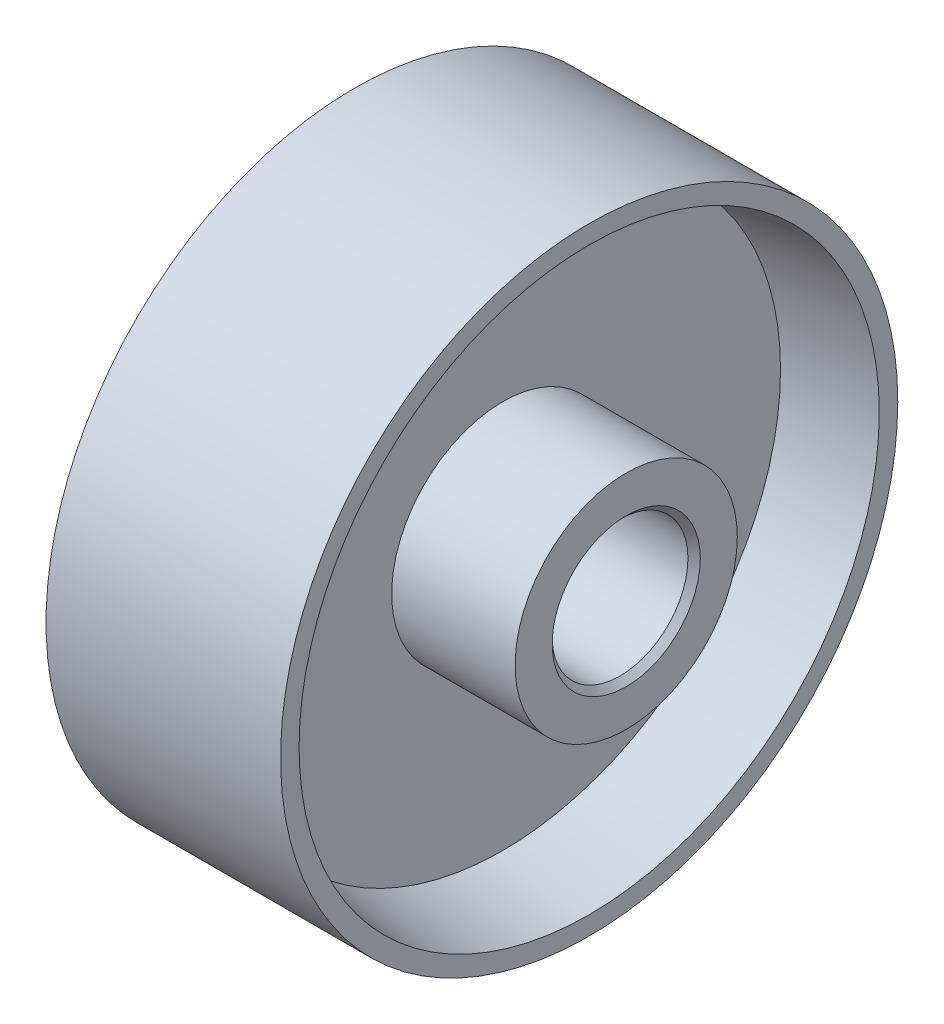
ISO-10303-21;
HEADER;
FILE_DESCRIPTION(('STEP AP214'),'2;1');
FILE_NAME('part.step','',(''),(''),'','','');
FILE_SCHEMA(('AUTOMOTIVE_DESIGN { 1 0 10303 214 1 1 1 1 }'));
ENDSEC;
DATA;
#1=APPLICATION_CONTEXT('core data for automotive mechanical design processes');
#2=APPLICATION_PROTOCOL_DEFINITION('international standard','automotive_design',2000,#1);
#3=PRODUCT_CONTEXT('',#1,'mechanical');
#4=PRODUCT('Part','Part','',(#3));
#5=PRODUCT_RELATED_PRODUCT_CATEGORY('part','',(#4));
#6=PRODUCT_DEFINITION_FORMATION('','',#4);
#7=PRODUCT_DEFINITION_CONTEXT('part definition',#1,'design');
#8=PRODUCT_DEFINITION('design','',#6,#7);
#9=PRODUCT_DEFINITION_SHAPE('','',#8);
#10=(LENGTH_UNIT() NAMED_UNIT(*) SI_UNIT(.MILLI.,.METRE.));
#11=(NAMED_UNIT(*) PLANE_ANGLE_UNIT() SI_UNIT($,.RADIAN.));
#12=(NAMED_UNIT(*) SI_UNIT($,.STERADIAN.) SOLID_ANGLE_UNIT());
#13=UNCERTAINTY_MEASURE_WITH_UNIT(LENGTH_MEASURE(1.E-05),#10,'distance_accuracy_value','');
#14=(GEOMETRIC_REPRESENTATION_CONTEXT(3) GLOBAL_UNCERTAINTY_ASSIGNED_CONTEXT((#13)) GLOBAL_UNIT_ASSIGNED_CONTEXT((#10,
#11,#12)) REPRESENTATION_CONTEXT('',''));
#15=CARTESIAN_POINT('',(0.,0.,0.));
#16=DIRECTION('',(0.,0.,1.));
#17=DIRECTION('',(1.,0.,0.));
#18=AXIS2_PLACEMENT_3D('',#15,#16,#17);
#19=CARTESIAN_POINT('',(-25.,18.,0.));
#20=DIRECTION('',(-1.,0.,0.));
#21=DIRECTION('',(0.,0.,1.));
#22=AXIS2_PLACEMENT_3D('',#19,#20,#21);
#23=PLANE('',#22);
#24=CARTESIAN_POINT('',(-25.,0.,0.));
#25=DIRECTION('',(-1.,0.,0.));
#26=DIRECTION('',(0.,0.,1.));
#27=AXIS2_PLACEMENT_3D('',#24,#25,#26);
#28=CIRCLE('',#27,12.);
#29=CARTESIAN_POINT('',(-25.,0.,12.));
#30=VERTEX_POINT('',#29);
#31=EDGE_CURVE('E45',#30,#30,#28,.F.);
#32=ORIENTED_EDGE('',*,*,#31,.T.);
#33=EDGE_LOOP('',(#32));
#34=FACE_BOUND('',#33,.T.);
#35=CARTESIAN_POINT('',(-25.,0.,0.));
#36=DIRECTION('',(1.,0.,0.));
#37=DIRECTION('',(0.,0.,-1.));
#38=AXIS2_PLACEMENT_3D('',#35,#36,#37);
#39=CIRCLE('',#38,18.);
#40=CARTESIAN_POINT('',(-25.,0.,-18.));
#41=VERTEX_POINT('',#40);
#42=EDGE_CURVE('E50',#41,#41,#39,.T.);
#43=ORIENTED_EDGE('',*,*,#42,.F.);
#44=EDGE_LOOP('',(#43));
#45=FACE_BOUND('',#44,.T.);
#46=ADVANCED_FACE('F30',(#34,#45),#23,.T.);
#47=CARTESIAN_POINT('',(-40.6358428805237,0.,0.));
#48=DIRECTION('',(1.,0.,0.));
#49=DIRECTION('',(0.,0.,-1.));
#50=AXIS2_PLACEMENT_3D('',#47,#48,#49);
#51=CYLINDRICAL_SURFACE('',#50,18.);
#52=ORIENTED_EDGE('',*,*,#42,.T.);
#53=EDGE_LOOP('',(#52));
#54=FACE_BOUND('',#53,.T.);
#55=CARTESIAN_POINT('',(-5.,0.,0.));
#56=DIRECTION('',(1.,0.,0.));
#57=DIRECTION('',(0.,0.,-1.));
#58=AXIS2_PLACEMENT_3D('',#55,#56,#57);
#59=CIRCLE('',#58,18.);
#60=CARTESIAN_POINT('',(-5.,0.,-18.));
#61=VERTEX_POINT('',#60);
#62=EDGE_CURVE('E53',#61,#61,#59,.T.);
#63=ORIENTED_EDGE('',*,*,#62,.F.);
#64=EDGE_LOOP('',(#63));
#65=FACE_BOUND('',#64,.T.);
#66=ADVANCED_FACE('F98',(#54,#65),#51,.T.);
#67=CARTESIAN_POINT('',(-5.,45.,0.));
#68=DIRECTION('',(-1.,0.,0.));
#69=DIRECTION('',(0.,0.,1.));
#70=AXIS2_PLACEMENT_3D('',#67,#68,#69);
#71=PLANE('',#70);
#72=ORIENTED_EDGE('',*,*,#62,.T.);
#73=EDGE_LOOP('',(#72));
#74=FACE_BOUND('',#73,.T.);
#75=CARTESIAN_POINT('',(-5.,0.,0.));
#76=DIRECTION('',(1.,0.,0.));
#77=DIRECTION('',(0.,0.,-1.));
#78=AXIS2_PLACEMENT_3D('',#75,#76,#77);
#79=CIRCLE('',#78,45.);
#80=CARTESIAN_POINT('',(-5.,0.,-45.));
#81=VERTEX_POINT('',#80);
#82=EDGE_CURVE('E56',#81,#81,#79,.T.);
#83=ORIENTED_EDGE('',*,*,#82,.F.);
#84=EDGE_LOOP('',(#83));
#85=FACE_BOUND('',#84,.T.);
#86=ADVANCED_FACE('F104',(#74,#85),#71,.T.);
#87=CARTESIAN_POINT('',(-19.,0.,0.));
#88=DIRECTION('',(-1.,0.,0.));
#89=DIRECTION('',(0.,0.,1.));
#90=AXIS2_PLACEMENT_3D('',#87,#88,#89);
#91=CONICAL_SURFACE('',#90,47.,0.141897054604164);
#92=ORIENTED_EDGE('',*,*,#82,.T.);
#93=EDGE_LOOP('',(#92));
#94=FACE_BOUND('',#93,.T.);
#95=CARTESIAN_POINT('',(-19.,0.,0.));
#96=DIRECTION('',(1.,0.,0.));
#97=DIRECTION('',(0.,0.,-1.));
#98=AXIS2_PLACEMENT_3D('',#95,#96,#97);
#99=CIRCLE('',#98,47.);
#100=CARTESIAN_POINT('',(-19.,0.,-47.));
#101=VERTEX_POINT('',#100);
#102=EDGE_CURVE('E59',#101,#101,#99,.T.);
#103=ORIENTED_EDGE('',*,*,#102,.F.);
#104=EDGE_LOOP('',(#103));
#105=FACE_BOUND('',#104,.T.);
#106=ADVANCED_FACE('F183',(#94,#105),#91,.F.);
#107=CARTESIAN_POINT('',(-19.,50.,0.));
#108=DIRECTION('',(-1.,0.,0.));
#109=DIRECTION('',(0.,0.,1.));
#110=AXIS2_PLACEMENT_3D('',#107,#108,#109);
#111=PLANE('',#110);
#112=ORIENTED_EDGE('',*,*,#102,.T.);
#113=EDGE_LOOP('',(#112));
#114=FACE_BOUND('',#113,.T.);
#115=CARTESIAN_POINT('',(-19.,0.,0.));
#116=DIRECTION('',(1.,0.,0.));
#117=DIRECTION('',(0.,0.,-1.));
#118=AXIS2_PLACEMENT_3D('',#115,#116,#117);
#119=CIRCLE('',#118,50.);
#120=CARTESIAN_POINT('',(-19.,0.,-50.));
#121=VERTEX_POINT('',#120);
#122=EDGE_CURVE('E62',#121,#121,#119,.T.);
#123=ORIENTED_EDGE('',*,*,#122,.F.);
#124=EDGE_LOOP('',(#123));
#125=FACE_BOUND('',#124,.T.);
#126=ADVANCED_FACE('F173',(#114,#125),#111,.T.);
#127=CARTESIAN_POINT('',(-40.6358428805237,0.,0.));
#128=DIRECTION('',(1.,0.,0.));
#129=DIRECTION('',(0.,0.,-1.));
#130=AXIS2_PLACEMENT_3D('',#127,#128,#129);
#131=CYLINDRICAL_SURFACE('',#130,50.);
#132=ORIENTED_EDGE('',*,*,#122,.T.);
#133=EDGE_LOOP('',(#132));
#134=FACE_BOUND('',#133,.T.);
#135=CARTESIAN_POINT('',(19.,0.,0.));
#136=DIRECTION('',(1.,0.,0.));
#137=DIRECTION('',(0.,0.,-1.));
#138=AXIS2_PLACEMENT_3D('',#135,#136,#137);
#139=CIRCLE('',#138,50.);
#140=CARTESIAN_POINT('',(19.,0.,-50.));
#141=VERTEX_POINT('',#140);
#142=EDGE_CURVE('E65',#141,#141,#139,.T.);
#143=ORIENTED_EDGE('',*,*,#142,.F.);
#144=EDGE_LOOP('',(#143));
#145=FACE_BOUND('',#144,.T.);
#146=ADVANCED_FACE('F163',(#134,#145),#131,.T.);
#147=CARTESIAN_POINT('',(19.,47.,0.));
#148=DIRECTION('',(1.,0.,0.));
#149=DIRECTION('',(0.,0.,-1.));
#150=AXIS2_PLACEMENT_3D('',#147,#148,#149);
#151=PLANE('',#150);
#152=ORIENTED_EDGE('',*,*,#142,.T.);
#153=EDGE_LOOP('',(#152));
#154=FACE_BOUND('',#153,.T.);
#155=CARTESIAN_POINT('',(19.,0.,0.));
#156=DIRECTION('',(1.,0.,0.));
#157=DIRECTION('',(0.,0.,-1.));
#158=AXIS2_PLACEMENT_3D('',#155,#156,#157);
#159=CIRCLE('',#158,47.);
#160=CARTESIAN_POINT('',(19.,0.,-47.));
#161=VERTEX_POINT('',#160);
#162=EDGE_CURVE('E68',#161,#161,#159,.T.);
#163=ORIENTED_EDGE('',*,*,#162,.F.);
#164=EDGE_LOOP('',(#163));
#165=FACE_BOUND('',#164,.T.);
#166=ADVANCED_FACE('F153',(#154,#165),#151,.T.);
#167=CARTESIAN_POINT('',(5.,0.,0.));
#168=DIRECTION('',(1.,0.,0.));
#169=DIRECTION('',(0.,0.,-1.));
#170=AXIS2_PLACEMENT_3D('',#167,#168,#169);
#171=CONICAL_SURFACE('',#170,45.,0.141897054604164);
#172=ORIENTED_EDGE('',*,*,#162,.T.);
#173=EDGE_LOOP('',(#172));
#174=FACE_BOUND('',#173,.T.);
#175=CARTESIAN_POINT('',(5.,0.,0.));
#176=DIRECTION('',(1.,0.,0.));
#177=DIRECTION('',(0.,0.,-1.));
#178=AXIS2_PLACEMENT_3D('',#175,#176,#177);
#179=CIRCLE('',#178,45.);
#180=CARTESIAN_POINT('',(5.,0.,-45.));
#181=VERTEX_POINT('',#180);
#182=EDGE_CURVE('E71',#181,#181,#179,.T.);
#183=ORIENTED_EDGE('',*,*,#182,.F.);
#184=EDGE_LOOP('',(#183));
#185=FACE_BOUND('',#184,.T.);
#186=ADVANCED_FACE('F94',(#174,#185),#171,.F.);
#187=CARTESIAN_POINT('',(5.,18.,0.));
#188=DIRECTION('',(1.,0.,0.));
#189=DIRECTION('',(0.,0.,-1.));
#190=AXIS2_PLACEMENT_3D('',#187,#188,#189);
#191=PLANE('',#190);
#192=ORIENTED_EDGE('',*,*,#182,.T.);
#193=EDGE_LOOP('',(#192));
#194=FACE_BOUND('',#193,.T.);
#195=CARTESIAN_POINT('',(5.,0.,0.));
#196=DIRECTION('',(1.,0.,0.));
#197=DIRECTION('',(0.,0.,-1.));
#198=AXIS2_PLACEMENT_3D('',#195,#196,#197);
#199=CIRCLE('',#198,18.);
#200=CARTESIAN_POINT('',(5.,0.,-18.));
#201=VERTEX_POINT('',#200);
#202=EDGE_CURVE('E74',#201,#201,#199,.T.);
#203=ORIENTED_EDGE('',*,*,#202,.F.);
#204=EDGE_LOOP('',(#203));
#205=FACE_BOUND('',#204,.T.);
#206=ADVANCED_FACE('F85',(#194,#205),#191,.T.);
#207=CARTESIAN_POINT('',(-40.6358428805237,0.,0.));
#208=DIRECTION('',(1.,0.,0.));
#209=DIRECTION('',(0.,0.,-1.));
#210=AXIS2_PLACEMENT_3D('',#207,#208,#209);
#211=CYLINDRICAL_SURFACE('',#210,18.);
#212=ORIENTED_EDGE('',*,*,#202,.T.);
#213=EDGE_LOOP('',(#212));
#214=FACE_BOUND('',#213,.T.);
#215=CARTESIAN_POINT('',(25.,0.,0.));
#216=DIRECTION('',(1.,0.,0.));
#217=DIRECTION('',(0.,0.,-1.));
#218=AXIS2_PLACEMENT_3D('',#215,#216,#217);
#219=CIRCLE('',#218,18.);
#220=CARTESIAN_POINT('',(25.,0.,-18.));
#221=VERTEX_POINT('',#220);
#222=EDGE_CURVE('E77',#221,#221,#219,.T.);
#223=ORIENTED_EDGE('',*,*,#222,.F.);
#224=EDGE_LOOP('',(#223));
#225=FACE_BOUND('',#224,.T.);
#226=ADVANCED_FACE('F83',(#214,#225),#211,.T.);
#227=CARTESIAN_POINT('',(25.,11.,0.));
#228=DIRECTION('',(1.,0.,0.));
#229=DIRECTION('',(0.,0.,-1.));
#230=AXIS2_PLACEMENT_3D('',#227,#228,#229);
#231=PLANE('',#230);
#232=CARTESIAN_POINT('',(25.,0.,0.));
#233=DIRECTION('',(1.,0.,0.));
#234=DIRECTION('',(0.,0.,-1.));
#235=AXIS2_PLACEMENT_3D('',#232,#233,#234);
#236=CIRCLE('',#235,12.);
#237=CARTESIAN_POINT('',(25.,0.,-12.));
#238=VERTEX_POINT('',#237);
#239=EDGE_CURVE('E10',#238,#238,#236,.F.);
#240=ORIENTED_EDGE('',*,*,#239,.T.);
#241=EDGE_LOOP('',(#240));
#242=FACE_BOUND('',#241,.T.);
#243=ORIENTED_EDGE('',*,*,#222,.T.);
#244=EDGE_LOOP('',(#243));
#245=FACE_BOUND('',#244,.T.);
#246=ADVANCED_FACE('F81',(#242,#245),#231,.T.);
#247=CARTESIAN_POINT('',(-40.6358428805237,0.,0.));
#248=DIRECTION('',(1.,0.,0.));
#249=DIRECTION('',(0.,0.,-1.));
#250=AXIS2_PLACEMENT_3D('',#247,#248,#249);
#251=CYLINDRICAL_SURFACE('',#250,11.);
#252=CARTESIAN_POINT('',(-24.,0.,0.));
#253=DIRECTION('',(-1.,0.,0.));
#254=DIRECTION('',(0.,0.,1.));
#255=AXIS2_PLACEMENT_3D('',#252,#253,#254);
#256=CIRCLE('',#255,11.);
#257=CARTESIAN_POINT('',(-24.,0.,11.));
#258=VERTEX_POINT('',#257);
#259=EDGE_CURVE('E37',#258,#258,#256,.T.);
#260=ORIENTED_EDGE('',*,*,#259,.T.);
#261=EDGE_LOOP('',(#260));
#262=FACE_BOUND('',#261,.T.);
#263=CARTESIAN_POINT('',(24.,0.,0.));
#264=DIRECTION('',(1.,0.,0.));
#265=DIRECTION('',(0.,0.,-1.));
#266=AXIS2_PLACEMENT_3D('',#263,#264,#265);
#267=CIRCLE('',#266,11.);
#268=CARTESIAN_POINT('',(24.,0.,-11.));
#269=VERTEX_POINT('',#268);
#270=EDGE_CURVE('E41',#269,#269,#267,.T.);
#271=ORIENTED_EDGE('',*,*,#270,.T.);
#272=EDGE_LOOP('',(#271));
#273=FACE_BOUND('',#272,.T.);
#274=ADVANCED_FACE('F92',(#262,#273),#251,.F.);
#275=CARTESIAN_POINT('',(-25.,0.,0.));
#276=DIRECTION('',(-1.,0.,0.));
#277=DIRECTION('',(0.,0.,1.));
#278=AXIS2_PLACEMENT_3D('',#275,#276,#277);
#279=CONICAL_SURFACE('',#278,12.,0.785398163397447);
#280=ORIENTED_EDGE('',*,*,#259,.F.);
#281=EDGE_LOOP('',(#280));
#282=FACE_BOUND('',#281,.T.);
#283=ORIENTED_EDGE('',*,*,#31,.F.);
#284=EDGE_LOOP('',(#283));
#285=FACE_BOUND('',#284,.T.);
#286=ADVANCED_FACE('F109',(#282,#285),#279,.F.);
#287=CARTESIAN_POINT('',(24.,0.,0.));
#288=DIRECTION('',(1.,0.,0.));
#289=DIRECTION('',(0.,0.,-1.));
#290=AXIS2_PLACEMENT_3D('',#287,#288,#289);
#291=CONICAL_SURFACE('',#290,11.,0.785398163397454);
#292=ORIENTED_EDGE('',*,*,#239,.F.);
#293=EDGE_LOOP('',(#292));
#294=FACE_BOUND('',#293,.T.);
#295=ORIENTED_EDGE('',*,*,#270,.F.);
#296=EDGE_LOOP('',(#295));
#297=FACE_BOUND('',#296,.T.);
#298=ADVANCED_FACE('F32',(#294,#297),#291,.F.);
#299=CLOSED_SHELL('',(#46,#66,#86,#106,#126,#146,#166,#186,#206,#226,#246,#274,#286,#298));
#300=MANIFOLD_SOLID_BREP('B2',#299);
#301=ADVANCED_BREP_SHAPE_REPRESENTATION('',(#18,#300),#14);
#302=SHAPE_DEFINITION_REPRESENTATION(#9,#301);
ENDSEC;
END-ISO-10303-21;
